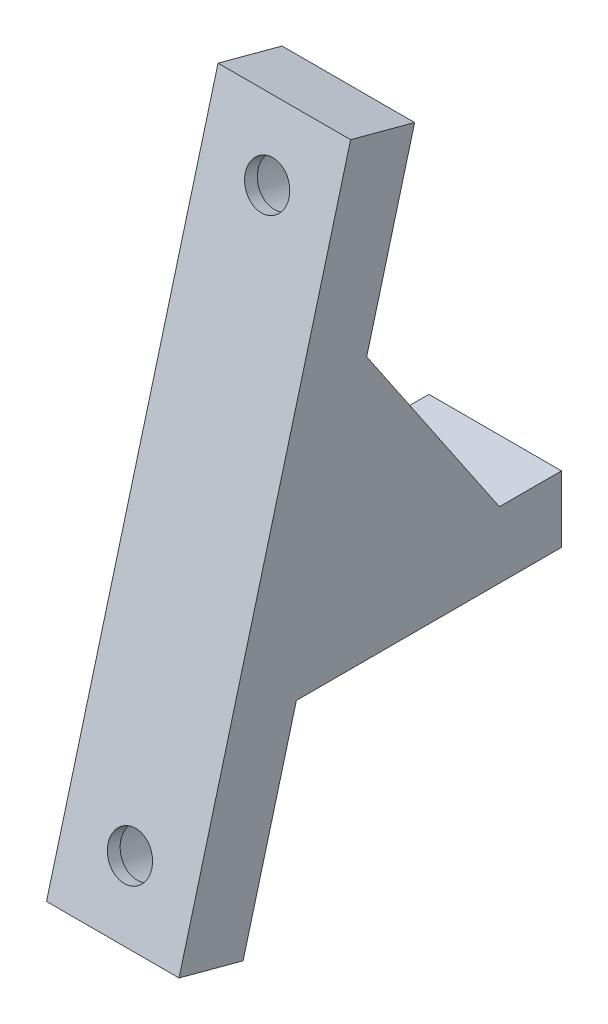
ISO-10303-21;
HEADER;
FILE_DESCRIPTION(('STEP AP214'),'2;1');
FILE_NAME('part.step','',(''),(''),'','','');
FILE_SCHEMA(('AUTOMOTIVE_DESIGN { 1 0 10303 214 1 1 1 1 }'));
ENDSEC;
DATA;
#1=APPLICATION_CONTEXT('core data for automotive mechanical design processes');
#2=APPLICATION_PROTOCOL_DEFINITION('international standard','automotive_design',2000,#1);
#3=PRODUCT_CONTEXT('',#1,'mechanical');
#4=PRODUCT('Part','Part','',(#3));
#5=PRODUCT_RELATED_PRODUCT_CATEGORY('part','',(#4));
#6=PRODUCT_DEFINITION_FORMATION('','',#4);
#7=PRODUCT_DEFINITION_CONTEXT('part definition',#1,'design');
#8=PRODUCT_DEFINITION('design','',#6,#7);
#9=PRODUCT_DEFINITION_SHAPE('','',#8);
#10=(LENGTH_UNIT() NAMED_UNIT(*) SI_UNIT(.MILLI.,.METRE.));
#11=(NAMED_UNIT(*) PLANE_ANGLE_UNIT() SI_UNIT($,.RADIAN.));
#12=(NAMED_UNIT(*) SI_UNIT($,.STERADIAN.) SOLID_ANGLE_UNIT());
#13=UNCERTAINTY_MEASURE_WITH_UNIT(LENGTH_MEASURE(1.E-05),#10,'distance_accuracy_value','');
#14=(GEOMETRIC_REPRESENTATION_CONTEXT(3) GLOBAL_UNCERTAINTY_ASSIGNED_CONTEXT((#13)) GLOBAL_UNIT_ASSIGNED_CONTEXT((#10,
#11,#12)) REPRESENTATION_CONTEXT('',''));
#15=CARTESIAN_POINT('',(0.,0.,0.));
#16=DIRECTION('',(0.,0.,1.));
#17=DIRECTION('',(1.,0.,0.));
#18=AXIS2_PLACEMENT_3D('',#15,#16,#17);
#19=CARTESIAN_POINT('',(5.,6.12372435695797,3.53553390593273));
#20=DIRECTION('',(0.,-0.258819045102525,-0.965925826289067));
#21=DIRECTION('',(0.,0.965925826289067,-0.258819045102525));
#22=AXIS2_PLACEMENT_3D('',#19,#20,#21);
#23=CYLINDRICAL_SURFACE('',#22,1.65);
#24=CARTESIAN_POINT('',(5.,4.82962913144534,-1.29409522551262));
#25=DIRECTION('',(0.,0.258819045102524,0.965925826289067));
#26=DIRECTION('',(0.,-0.965925826289068,0.258819045102524));
#27=AXIS2_PLACEMENT_3D('',#24,#25,#26);
#28=CIRCLE('',#27,1.65);
#29=CARTESIAN_POINT('',(5.,3.23585151806838,-0.867043801093457));
#30=VERTEX_POINT('',#29);
#31=EDGE_CURVE('E193',#30,#30,#28,.T.);
#32=ORIENTED_EDGE('',*,*,#31,.T.);
#33=EDGE_LOOP('',(#32));
#34=FACE_BOUND('',#33,.T.);
#35=CARTESIAN_POINT('',(5.,4.57081008634282,-2.26002105180168));
#36=DIRECTION('',(0.,-0.258819045102524,-0.965925826289067));
#37=DIRECTION('',(0.,0.965925826289067,-0.258819045102524));
#38=AXIS2_PLACEMENT_3D('',#35,#36,#37);
#39=CIRCLE('',#38,1.65);
#40=CARTESIAN_POINT('',(5.,6.16458769971978,-2.68707247622084));
#41=VERTEX_POINT('',#40);
#42=EDGE_CURVE('E49',#41,#41,#39,.F.);
#43=ORIENTED_EDGE('',*,*,#42,.F.);
#44=EDGE_LOOP('',(#43));
#45=FACE_BOUND('',#44,.T.);
#46=ADVANCED_FACE('F45',(#34,#45),#23,.F.);
#47=CARTESIAN_POINT('',(5.,44.7607574085207,-6.81722789816826));
#48=DIRECTION('',(0.,-0.258819045102525,-0.965925826289067));
#49=DIRECTION('',(0.,0.965925826289067,-0.258819045102525));
#50=AXIS2_PLACEMENT_3D('',#47,#48,#49);
#51=CYLINDRICAL_SURFACE('',#50,1.65);
#52=CARTESIAN_POINT('',(5.,43.466662183008,-11.6468570296136));
#53=DIRECTION('',(0.,0.258819045102524,0.965925826289067));
#54=DIRECTION('',(0.,-0.965925826289068,0.258819045102524));
#55=AXIS2_PLACEMENT_3D('',#52,#53,#54);
#56=CIRCLE('',#55,1.65);
#57=CARTESIAN_POINT('',(5.,41.8728845696311,-11.2198056051944));
#58=VERTEX_POINT('',#57);
#59=EDGE_CURVE('E158',#58,#58,#56,.T.);
#60=ORIENTED_EDGE('',*,*,#59,.T.);
#61=EDGE_LOOP('',(#60));
#62=FACE_BOUND('',#61,.T.);
#63=CARTESIAN_POINT('',(5.,43.2078431379055,-12.6127828559027));
#64=DIRECTION('',(0.,-0.258819045102524,-0.965925826289067));
#65=DIRECTION('',(0.,0.965925826289067,-0.258819045102524));
#66=AXIS2_PLACEMENT_3D('',#63,#64,#65);
#67=CIRCLE('',#66,1.65);
#68=CARTESIAN_POINT('',(5.,44.8016207512825,-13.0398342803218));
#69=VERTEX_POINT('',#68);
#70=EDGE_CURVE('E194',#69,#69,#67,.F.);
#71=ORIENTED_EDGE('',*,*,#70,.F.);
#72=EDGE_LOOP('',(#71));
#73=FACE_BOUND('',#72,.T.);
#74=ADVANCED_FACE('F277',(#62,#73),#51,.F.);
#75=CARTESIAN_POINT('',(10.,17.0806955361724,-25.2627557915542));
#76=DIRECTION('',(0.,0.560111023198253,-0.82841755274246));
#77=DIRECTION('',(0.,0.82841755274246,0.560111023198253));
#78=AXIS2_PLACEMENT_3D('',#75,#76,#77);
#79=PLANE('',#78);
#80=DIRECTION('',(-1.,0.,0.));
#81=VECTOR('',#80,1.);
#82=CARTESIAN_POINT('',(10.,18.7059047744874,-24.1639166779088));
#83=LINE('',#82,#81);
#84=CARTESIAN_POINT('',(10.,18.7059047744874,-24.1639166779088));
#85=VERTEX_POINT('',#84);
#86=CARTESIAN_POINT('',(7.98341142180157,18.7059047744874,-24.1639166779088));
#87=VERTEX_POINT('',#86);
#88=EDGE_CURVE('E64',#85,#87,#83,.T.);
#89=ORIENTED_EDGE('',*,*,#88,.T.);
#90=CARTESIAN_POINT('',(5.,19.1718707303731,-23.8488670179122));
#91=DIRECTION('',(0.,0.560111023198253,-0.82841755274246));
#92=DIRECTION('',(0.,-0.82841755274246,-0.560111023198253));
#93=AXIS2_PLACEMENT_3D('',#90,#91,#92);
#94=ELLIPSE('',#93,5.35608098349841,3.);
#95=CARTESIAN_POINT('',(2.01658857819843,18.7059047744874,-24.1639166779088));
#96=VERTEX_POINT('',#95);
#97=EDGE_CURVE('E216',#87,#96,#94,.F.);
#98=ORIENTED_EDGE('',*,*,#97,.T.);
#99=CARTESIAN_POINT('',(0.,18.7059047744874,-24.1639166779088));
#100=VERTEX_POINT('',#99);
#101=EDGE_CURVE('E103',#96,#100,#83,.T.);
#102=ORIENTED_EDGE('',*,*,#101,.T.);
#103=DIRECTION('',(0.,-0.82841755274246,-0.560111023198253));
#104=VECTOR('',#103,1.);
#105=CARTESIAN_POINT('',(0.,17.0806955361724,-25.2627557915542));
#106=LINE('',#105,#104);
#107=CARTESIAN_POINT('',(0.,33.5091413721001,-14.1551282717651));
#108=VERTEX_POINT('',#107);
#109=EDGE_CURVE('E155',#108,#100,#106,.T.);
#110=ORIENTED_EDGE('',*,*,#109,.F.);
#111=DIRECTION('',(-1.,0.,0.));
#112=VECTOR('',#111,1.);
#113=CARTESIAN_POINT('',(10.,33.5091413721001,-14.1551282717651));
#114=LINE('',#113,#112);
#115=CARTESIAN_POINT('',(10.,33.5091413721001,-14.1551282717651));
#116=VERTEX_POINT('',#115);
#117=EDGE_CURVE('E55',#116,#108,#114,.T.);
#118=ORIENTED_EDGE('',*,*,#117,.F.);
#119=DIRECTION('',(0.,-0.82841755274246,-0.560111023198253));
#120=VECTOR('',#119,1.);
#121=CARTESIAN_POINT('',(10.,17.0806955361724,-25.2627557915542));
#122=LINE('',#121,#120);
#123=EDGE_CURVE('E178',#116,#85,#122,.T.);
#124=ORIENTED_EDGE('',*,*,#123,.T.);
#125=EDGE_LOOP('',(#89,#98,#102,#110,#118,#124));
#126=FACE_BOUND('',#125,.T.);
#127=ADVANCED_FACE('F47',(#126),#79,.T.);
#128=CARTESIAN_POINT('',(5.,28.7059047744874,-23.8488670179122));
#129=DIRECTION('',(0.,-1.,0.));
#130=DIRECTION('',(0.,0.,-1.));
#131=AXIS2_PLACEMENT_3D('',#128,#129,#130);
#132=CYLINDRICAL_SURFACE('',#131,1.65);
#133=CARTESIAN_POINT('',(5.,13.7059047744874,-23.8488670179122));
#134=DIRECTION('',(0.,-1.,0.));
#135=DIRECTION('',(0.,0.,-1.));
#136=AXIS2_PLACEMENT_3D('',#133,#134,#135);
#137=CIRCLE('',#136,1.65);
#138=CARTESIAN_POINT('',(5.,13.7059047744874,-25.4988670179122));
#139=VERTEX_POINT('',#138);
#140=EDGE_CURVE('E218',#139,#139,#137,.F.);
#141=ORIENTED_EDGE('',*,*,#140,.F.);
#142=EDGE_LOOP('',(#141));
#143=FACE_BOUND('',#142,.T.);
#144=CARTESIAN_POINT('',(5.,18.7059047744874,-23.8488670179122));
#145=DIRECTION('',(0.,1.,0.));
#146=DIRECTION('',(0.,0.,1.));
#147=AXIS2_PLACEMENT_3D('',#144,#145,#146);
#148=CIRCLE('',#147,1.65);
#149=CARTESIAN_POINT('',(5.,18.7059047744874,-22.1988670179122));
#150=VERTEX_POINT('',#149);
#151=EDGE_CURVE('E11',#150,#150,#148,.F.);
#152=ORIENTED_EDGE('',*,*,#151,.F.);
#153=EDGE_LOOP('',(#152));
#154=FACE_BOUND('',#153,.T.);
#155=ADVANCED_FACE('F322',(#143,#154),#132,.F.);
#156=CARTESIAN_POINT('',(10.,-1.29409522551262,-4.82962913144532));
#157=DIRECTION('',(0.,-0.258819045102524,-0.965925826289067));
#158=DIRECTION('',(0.,0.965925826289067,-0.258819045102524));
#159=AXIS2_PLACEMENT_3D('',#156,#157,#158);
#160=PLANE('',#159);
#161=CARTESIAN_POINT('',(5.,42.1725669574954,-16.4764861610589));
#162=DIRECTION('',(0.,-0.258819045102524,-0.965925826289067));
#163=DIRECTION('',(0.,0.965925826289067,-0.258819045102524));
#164=AXIS2_PLACEMENT_3D('',#161,#162,#163);
#165=CIRCLE('',#164,2.25);
#166=CARTESIAN_POINT('',(5.,44.3459000666458,-17.0588290125396));
#167=VERTEX_POINT('',#166);
#168=EDGE_CURVE('E202',#167,#167,#165,.T.);
#169=ORIENTED_EDGE('',*,*,#168,.F.);
#170=EDGE_LOOP('',(#169));
#171=FACE_BOUND('',#170,.T.);
#172=DIRECTION('',(0.,-0.965925826289067,0.258819045102524));
#173=VECTOR('',#172,1.);
#174=CARTESIAN_POINT('',(0.,-1.29409522551262,-4.82962913144532));
#175=LINE('',#174,#173);
#176=CARTESIAN_POINT('',(0.,47.0021960889408,-17.7705813865715));
#177=VERTEX_POINT('',#176);
#178=EDGE_CURVE('E157',#177,#108,#175,.T.);
#179=ORIENTED_EDGE('',*,*,#178,.F.);
#180=DIRECTION('',(-1.,0.,0.));
#181=VECTOR('',#180,1.);
#182=CARTESIAN_POINT('',(10.,47.0021960889408,-17.7705813865715));
#183=LINE('',#182,#181);
#184=CARTESIAN_POINT('',(10.,47.0021960889408,-17.7705813865715));
#185=VERTEX_POINT('',#184);
#186=EDGE_CURVE('E189',#185,#177,#183,.T.);
#187=ORIENTED_EDGE('',*,*,#186,.F.);
#188=DIRECTION('',(0.,-0.965925826289067,0.258819045102524));
#189=VECTOR('',#188,1.);
#190=CARTESIAN_POINT('',(10.,-1.29409522551262,-4.82962913144532));
#191=LINE('',#190,#189);
#192=EDGE_CURVE('E224',#185,#116,#191,.T.);
#193=ORIENTED_EDGE('',*,*,#192,.T.);
#194=ORIENTED_EDGE('',*,*,#117,.T.);
#195=EDGE_LOOP('',(#179,#187,#193,#194));
#196=FACE_BOUND('',#195,.T.);
#197=ADVANCED_FACE('F256',(#171,#196),#160,.T.);
#198=CARTESIAN_POINT('',(10.,48.2962913144534,-12.9409522551261));
#199=DIRECTION('',(0.,0.965925826289068,-0.258819045102523));
#200=DIRECTION('',(0.,0.258819045102523,0.965925826289068));
#201=AXIS2_PLACEMENT_3D('',#198,#199,#200);
#202=PLANE('',#201);
#203=DIRECTION('',(0.,-0.258819045102523,-0.965925826289068));
#204=VECTOR('',#203,1.);
#205=CARTESIAN_POINT('',(0.,48.2962913144534,-12.9409522551261));
#206=LINE('',#205,#204);
#207=CARTESIAN_POINT('',(0.,48.2962913144534,-12.9409522551262));
#208=VERTEX_POINT('',#207);
#209=EDGE_CURVE('E161',#208,#177,#206,.T.);
#210=ORIENTED_EDGE('',*,*,#209,.F.);
#211=DIRECTION('',(-1.,0.,0.));
#212=VECTOR('',#211,1.);
#213=CARTESIAN_POINT('',(10.,48.2962913144534,-12.9409522551262));
#214=LINE('',#213,#212);
#215=CARTESIAN_POINT('',(10.,48.2962913144534,-12.9409522551262));
#216=VERTEX_POINT('',#215);
#217=EDGE_CURVE('E187',#216,#208,#214,.T.);
#218=ORIENTED_EDGE('',*,*,#217,.F.);
#219=DIRECTION('',(0.,-0.258819045102523,-0.965925826289068));
#220=VECTOR('',#219,1.);
#221=CARTESIAN_POINT('',(10.,48.2962913144534,-12.9409522551261));
#222=LINE('',#221,#220);
#223=EDGE_CURVE('E227',#216,#185,#222,.T.);
#224=ORIENTED_EDGE('',*,*,#223,.T.);
#225=ORIENTED_EDGE('',*,*,#186,.T.);
#226=EDGE_LOOP('',(#210,#218,#224,#225));
#227=FACE_BOUND('',#226,.T.);
#228=ADVANCED_FACE('F259',(#227),#202,.T.);
#229=CARTESIAN_POINT('',(10.,0.,0.));
#230=DIRECTION('',(0.,0.258819045102524,0.965925826289067));
#231=DIRECTION('',(0.,-0.965925826289068,0.258819045102524));
#232=AXIS2_PLACEMENT_3D('',#229,#230,#231);
#233=PLANE('',#232);
#234=ORIENTED_EDGE('',*,*,#59,.F.);
#235=EDGE_LOOP('',(#234));
#236=FACE_BOUND('',#235,.T.);
#237=ORIENTED_EDGE('',*,*,#31,.F.);
#238=EDGE_LOOP('',(#237));
#239=FACE_BOUND('',#238,.T.);
#240=DIRECTION('',(0.,0.965925826289067,-0.258819045102524));
#241=VECTOR('',#240,1.);
#242=CARTESIAN_POINT('',(0.,0.,0.));
#243=LINE('',#242,#241);
#244=CARTESIAN_POINT('',(0.,0.,0.));
#245=VERTEX_POINT('',#244);
#246=EDGE_CURVE('E164',#245,#208,#243,.T.);
#247=ORIENTED_EDGE('',*,*,#246,.F.);
#248=DIRECTION('',(-1.,0.,0.));
#249=VECTOR('',#248,1.);
#250=CARTESIAN_POINT('',(10.,0.,0.));
#251=LINE('',#250,#249);
#252=CARTESIAN_POINT('',(10.,0.,0.));
#253=VERTEX_POINT('',#252);
#254=EDGE_CURVE('E185',#253,#245,#251,.T.);
#255=ORIENTED_EDGE('',*,*,#254,.F.);
#256=DIRECTION('',(0.,0.965925826289067,-0.258819045102524));
#257=VECTOR('',#256,1.);
#258=CARTESIAN_POINT('',(10.,0.,0.));
#259=LINE('',#258,#257);
#260=EDGE_CURVE('E230',#253,#216,#259,.T.);
#261=ORIENTED_EDGE('',*,*,#260,.T.);
#262=ORIENTED_EDGE('',*,*,#217,.T.);
#263=EDGE_LOOP('',(#247,#255,#261,#262));
#264=FACE_BOUND('',#263,.T.);
#265=ADVANCED_FACE('F262',(#236,#239,#264),#233,.T.);
#266=CARTESIAN_POINT('',(10.,0.,0.));
#267=DIRECTION('',(0.,0.965925826289067,-0.258819045102524));
#268=DIRECTION('',(0.,0.258819045102524,0.965925826289067));
#269=AXIS2_PLACEMENT_3D('',#266,#267,#268);
#270=PLANE('',#269);
#271=DIRECTION('',(0.,-0.258819045102524,-0.965925826289067));
#272=VECTOR('',#271,1.);
#273=CARTESIAN_POINT('',(0.,0.,0.));
#274=LINE('',#273,#272);
#275=CARTESIAN_POINT('',(0.,-1.29409522551262,-4.82962913144533));
#276=VERTEX_POINT('',#275);
#277=EDGE_CURVE('E167',#245,#276,#274,.T.);
#278=ORIENTED_EDGE('',*,*,#277,.T.);
#279=DIRECTION('',(-1.,0.,0.));
#280=VECTOR('',#279,1.);
#281=CARTESIAN_POINT('',(10.,-1.29409522551262,-4.82962913144533));
#282=LINE('',#281,#280);
#283=CARTESIAN_POINT('',(10.,-1.29409522551262,-4.82962913144533));
#284=VERTEX_POINT('',#283);
#285=EDGE_CURVE('E182',#284,#276,#282,.T.);
#286=ORIENTED_EDGE('',*,*,#285,.F.);
#287=DIRECTION('',(0.,-0.258819045102524,-0.965925826289067));
#288=VECTOR('',#287,1.);
#289=CARTESIAN_POINT('',(10.,0.,0.));
#290=LINE('',#289,#288);
#291=EDGE_CURVE('E233',#253,#284,#290,.T.);
#292=ORIENTED_EDGE('',*,*,#291,.F.);
#293=ORIENTED_EDGE('',*,*,#254,.T.);
#294=EDGE_LOOP('',(#278,#286,#292,#293));
#295=FACE_BOUND('',#294,.T.);
#296=ADVANCED_FACE('F239',(#295),#270,.F.);
#297=CARTESIAN_POINT('',(10.,-1.29409522551262,-4.82962913144533));
#298=DIRECTION('',(0.,0.258819045102524,0.965925826289067));
#299=DIRECTION('',(0.,-0.965925826289067,0.258819045102524));
#300=AXIS2_PLACEMENT_3D('',#297,#298,#299);
#301=PLANE('',#300);
#302=CARTESIAN_POINT('',(5.,3.53553390593272,-6.12372435695795));
#303=DIRECTION('',(0.,-0.258819045102524,-0.965925826289067));
#304=DIRECTION('',(0.,0.965925826289067,-0.258819045102524));
#305=AXIS2_PLACEMENT_3D('',#302,#303,#304);
#306=CIRCLE('',#305,2.25);
#307=CARTESIAN_POINT('',(5.,5.70886701508312,-6.70606720843863));
#308=VERTEX_POINT('',#307);
#309=EDGE_CURVE('E207',#308,#308,#306,.T.);
#310=ORIENTED_EDGE('',*,*,#309,.F.);
#311=EDGE_LOOP('',(#310));
#312=FACE_BOUND('',#311,.T.);
#313=DIRECTION('',(0.,0.965925826289067,-0.258819045102524));
#314=VECTOR('',#313,1.);
#315=CARTESIAN_POINT('',(0.,-1.29409522551262,-4.82962913144533));
#316=LINE('',#315,#314);
#317=CARTESIAN_POINT('',(0.,13.7059047744874,-8.84886701791223));
#318=VERTEX_POINT('',#317);
#319=EDGE_CURVE('E169',#276,#318,#316,.T.);
#320=ORIENTED_EDGE('',*,*,#319,.T.);
#321=DIRECTION('',(-1.,0.,0.));
#322=VECTOR('',#321,1.);
#323=CARTESIAN_POINT('',(10.,13.7059047744874,-8.84886701791223));
#324=LINE('',#323,#322);
#325=CARTESIAN_POINT('',(10.,13.7059047744874,-8.84886701791223));
#326=VERTEX_POINT('',#325);
#327=EDGE_CURVE('E138',#326,#318,#324,.T.);
#328=ORIENTED_EDGE('',*,*,#327,.F.);
#329=DIRECTION('',(0.,0.965925826289067,-0.258819045102524));
#330=VECTOR('',#329,1.);
#331=CARTESIAN_POINT('',(10.,-1.29409522551262,-4.82962913144533));
#332=LINE('',#331,#330);
#333=EDGE_CURVE('E146',#284,#326,#332,.T.);
#334=ORIENTED_EDGE('',*,*,#333,.F.);
#335=ORIENTED_EDGE('',*,*,#285,.T.);
#336=EDGE_LOOP('',(#320,#328,#334,#335));
#337=FACE_BOUND('',#336,.T.);
#338=ADVANCED_FACE('F243',(#312,#337),#301,.F.);
#339=CARTESIAN_POINT('',(10.,13.7059047744874,0.));
#340=DIRECTION('',(0.,-1.,0.));
#341=DIRECTION('',(0.,0.,-1.));
#342=AXIS2_PLACEMENT_3D('',#339,#340,#341);
#343=PLANE('',#342);
#344=ORIENTED_EDGE('',*,*,#140,.T.);
#345=EDGE_LOOP('',(#344));
#346=FACE_BOUND('',#345,.T.);
#347=DIRECTION('',(0.,0.,1.));
#348=VECTOR('',#347,1.);
#349=CARTESIAN_POINT('',(0.,13.7059047744874,0.));
#350=LINE('',#349,#348);
#351=CARTESIAN_POINT('',(0.,13.7059047744874,-28.8488670179122));
#352=VERTEX_POINT('',#351);
#353=EDGE_CURVE('E134',#352,#318,#350,.T.);
#354=ORIENTED_EDGE('',*,*,#353,.F.);
#355=DIRECTION('',(-1.,0.,0.));
#356=VECTOR('',#355,1.);
#357=CARTESIAN_POINT('',(10.,13.7059047744874,-28.8488670179122));
#358=LINE('',#357,#356);
#359=CARTESIAN_POINT('',(10.,13.7059047744874,-28.8488670179122));
#360=VERTEX_POINT('',#359);
#361=EDGE_CURVE('E129',#360,#352,#358,.T.);
#362=ORIENTED_EDGE('',*,*,#361,.F.);
#363=DIRECTION('',(0.,0.,1.));
#364=VECTOR('',#363,1.);
#365=CARTESIAN_POINT('',(10.,13.7059047744874,0.));
#366=LINE('',#365,#364);
#367=EDGE_CURVE('E132',#360,#326,#366,.T.);
#368=ORIENTED_EDGE('',*,*,#367,.T.);
#369=ORIENTED_EDGE('',*,*,#327,.T.);
#370=EDGE_LOOP('',(#354,#362,#368,#369));
#371=FACE_BOUND('',#370,.T.);
#372=ADVANCED_FACE('F131',(#346,#371),#343,.T.);
#373=CARTESIAN_POINT('',(10.,0.,-28.8488670179122));
#374=DIRECTION('',(0.,0.,-1.));
#375=DIRECTION('',(0.,1.,0.));
#376=AXIS2_PLACEMENT_3D('',#373,#374,#375);
#377=PLANE('',#376);
#378=DIRECTION('',(0.,-1.,0.));
#379=VECTOR('',#378,1.);
#380=CARTESIAN_POINT('',(0.,0.,-28.8488670179122));
#381=LINE('',#380,#379);
#382=CARTESIAN_POINT('',(0.,18.7059047744874,-28.8488670179122));
#383=VERTEX_POINT('',#382);
#384=EDGE_CURVE('E173',#383,#352,#381,.T.);
#385=ORIENTED_EDGE('',*,*,#384,.F.);
#386=DIRECTION('',(-1.,0.,0.));
#387=VECTOR('',#386,1.);
#388=CARTESIAN_POINT('',(10.,18.7059047744874,-28.8488670179122));
#389=LINE('',#388,#387);
#390=CARTESIAN_POINT('',(10.,18.7059047744874,-28.8488670179122));
#391=VERTEX_POINT('',#390);
#392=EDGE_CURVE('E95',#391,#383,#389,.T.);
#393=ORIENTED_EDGE('',*,*,#392,.F.);
#394=DIRECTION('',(0.,-1.,0.));
#395=VECTOR('',#394,1.);
#396=CARTESIAN_POINT('',(10.,0.,-28.8488670179122));
#397=LINE('',#396,#395);
#398=EDGE_CURVE('E144',#391,#360,#397,.T.);
#399=ORIENTED_EDGE('',*,*,#398,.T.);
#400=ORIENTED_EDGE('',*,*,#361,.T.);
#401=EDGE_LOOP('',(#385,#393,#399,#400));
#402=FACE_BOUND('',#401,.T.);
#403=ADVANCED_FACE('F149',(#402),#377,.T.);
#404=CARTESIAN_POINT('',(10.,18.7059047744874,0.));
#405=DIRECTION('',(0.,1.,0.));
#406=DIRECTION('',(0.,0.,1.));
#407=AXIS2_PLACEMENT_3D('',#404,#405,#406);
#408=PLANE('',#407);
#409=ORIENTED_EDGE('',*,*,#101,.F.);
#410=CARTESIAN_POINT('',(5.,18.7059047744874,-23.8488670179122));
#411=DIRECTION('',(0.,1.,0.));
#412=DIRECTION('',(0.,0.,1.));
#413=AXIS2_PLACEMENT_3D('',#410,#411,#412);
#414=CIRCLE('',#413,3.);
#415=EDGE_CURVE('E200',#96,#87,#414,.T.);
#416=ORIENTED_EDGE('',*,*,#415,.T.);
#417=ORIENTED_EDGE('',*,*,#88,.F.);
#418=DIRECTION('',(0.,0.,-1.));
#419=VECTOR('',#418,1.);
#420=CARTESIAN_POINT('',(10.,18.7059047744874,0.));
#421=LINE('',#420,#419);
#422=EDGE_CURVE('E150',#85,#391,#421,.T.);
#423=ORIENTED_EDGE('',*,*,#422,.T.);
#424=ORIENTED_EDGE('',*,*,#392,.T.);
#425=DIRECTION('',(0.,0.,-1.));
#426=VECTOR('',#425,1.);
#427=CARTESIAN_POINT('',(0.,18.7059047744874,0.));
#428=LINE('',#427,#426);
#429=EDGE_CURVE('E175',#100,#383,#428,.T.);
#430=ORIENTED_EDGE('',*,*,#429,.F.);
#431=EDGE_LOOP('',(#409,#416,#417,#423,#424,#430));
#432=FACE_BOUND('',#431,.T.);
#433=ORIENTED_EDGE('',*,*,#151,.T.);
#434=EDGE_LOOP('',(#433));
#435=FACE_BOUND('',#434,.T.);
#436=ADVANCED_FACE('F246',(#432,#435),#408,.T.);
#437=CARTESIAN_POINT('',(10.,0.,0.));
#438=DIRECTION('',(1.,0.,0.));
#439=DIRECTION('',(0.,0.,-1.));
#440=AXIS2_PLACEMENT_3D('',#437,#438,#439);
#441=PLANE('',#440);
#442=ORIENTED_EDGE('',*,*,#123,.F.);
#443=ORIENTED_EDGE('',*,*,#192,.F.);
#444=ORIENTED_EDGE('',*,*,#223,.F.);
#445=ORIENTED_EDGE('',*,*,#260,.F.);
#446=ORIENTED_EDGE('',*,*,#291,.T.);
#447=ORIENTED_EDGE('',*,*,#333,.T.);
#448=ORIENTED_EDGE('',*,*,#367,.F.);
#449=ORIENTED_EDGE('',*,*,#398,.F.);
#450=ORIENTED_EDGE('',*,*,#422,.F.);
#451=EDGE_LOOP('',(#442,#443,#444,#445,#446,#447,#448,#449,#450));
#452=FACE_BOUND('',#451,.T.);
#453=ADVANCED_FACE('F142',(#452),#441,.T.);
#454=CARTESIAN_POINT('',(0.,0.,0.));
#455=DIRECTION('',(1.,0.,0.));
#456=DIRECTION('',(0.,0.,-1.));
#457=AXIS2_PLACEMENT_3D('',#454,#455,#456);
#458=PLANE('',#457);
#459=ORIENTED_EDGE('',*,*,#109,.T.);
#460=ORIENTED_EDGE('',*,*,#429,.T.);
#461=ORIENTED_EDGE('',*,*,#384,.T.);
#462=ORIENTED_EDGE('',*,*,#353,.T.);
#463=ORIENTED_EDGE('',*,*,#319,.F.);
#464=ORIENTED_EDGE('',*,*,#277,.F.);
#465=ORIENTED_EDGE('',*,*,#246,.T.);
#466=ORIENTED_EDGE('',*,*,#209,.T.);
#467=ORIENTED_EDGE('',*,*,#178,.T.);
#468=EDGE_LOOP('',(#459,#460,#461,#462,#463,#464,#465,#466,#467));
#469=FACE_BOUND('',#468,.T.);
#470=ADVANCED_FACE('F245',(#469),#458,.F.);
#471=CARTESIAN_POINT('',(5.,26.7059047744874,-23.8488670179122));
#472=DIRECTION('',(0.,-1.,0.));
#473=DIRECTION('',(0.,0.,-1.));
#474=AXIS2_PLACEMENT_3D('',#471,#472,#473);
#475=CYLINDRICAL_SURFACE('',#474,3.);
#476=ORIENTED_EDGE('',*,*,#415,.F.);
#477=ORIENTED_EDGE('',*,*,#97,.F.);
#478=EDGE_LOOP('',(#476,#477));
#479=FACE_BOUND('',#478,.T.);
#480=ADVANCED_FACE('F252',(#479),#475,.F.);
#481=CARTESIAN_POINT('',(5.,43.2078431379055,-12.6127828559027));
#482=DIRECTION('',(0.,-0.258819045102524,-0.965925826289067));
#483=DIRECTION('',(0.,0.965925826289067,-0.258819045102524));
#484=AXIS2_PLACEMENT_3D('',#481,#482,#483);
#485=PLANE('',#484);
#486=CARTESIAN_POINT('',(5.,43.2078431379055,-12.6127828559027));
#487=DIRECTION('',(0.,-0.258819045102524,-0.965925826289067));
#488=DIRECTION('',(0.,0.965925826289067,-0.258819045102524));
#489=AXIS2_PLACEMENT_3D('',#486,#487,#488);
#490=CIRCLE('',#489,2.25);
#491=CARTESIAN_POINT('',(5.,45.3811762470559,-13.1951257073833));
#492=VERTEX_POINT('',#491);
#493=EDGE_CURVE('E196',#492,#492,#490,.T.);
#494=ORIENTED_EDGE('',*,*,#493,.T.);
#495=EDGE_LOOP('',(#494));
#496=FACE_BOUND('',#495,.T.);
#497=ORIENTED_EDGE('',*,*,#70,.T.);
#498=EDGE_LOOP('',(#497));
#499=FACE_BOUND('',#498,.T.);
#500=ADVANCED_FACE('F321',(#496,#499),#485,.T.);
#501=CARTESIAN_POINT('',(5.,43.2078431379055,-12.6127828559027));
#502=DIRECTION('',(0.,-0.258819045102524,-0.965925826289067));
#503=DIRECTION('',(0.,0.965925826289067,-0.258819045102524));
#504=AXIS2_PLACEMENT_3D('',#501,#502,#503);
#505=CYLINDRICAL_SURFACE('',#504,2.25);
#506=ORIENTED_EDGE('',*,*,#493,.F.);
#507=EDGE_LOOP('',(#506));
#508=FACE_BOUND('',#507,.T.);
#509=ORIENTED_EDGE('',*,*,#168,.T.);
#510=EDGE_LOOP('',(#509));
#511=FACE_BOUND('',#510,.T.);
#512=ADVANCED_FACE('F314',(#508,#511),#505,.F.);
#513=CARTESIAN_POINT('',(5.,4.57081008634282,-2.26002105180168));
#514=DIRECTION('',(0.,-0.258819045102524,-0.965925826289067));
#515=DIRECTION('',(0.,0.965925826289067,-0.258819045102524));
#516=AXIS2_PLACEMENT_3D('',#513,#514,#515);
#517=PLANE('',#516);
#518=CARTESIAN_POINT('',(5.,4.57081008634282,-2.26002105180168));
#519=DIRECTION('',(0.,-0.258819045102524,-0.965925826289067));
#520=DIRECTION('',(0.,0.965925826289067,-0.258819045102524));
#521=AXIS2_PLACEMENT_3D('',#518,#519,#520);
#522=CIRCLE('',#521,2.25);
#523=CARTESIAN_POINT('',(5.,6.74414319549322,-2.84236390328236));
#524=VERTEX_POINT('',#523);
#525=EDGE_CURVE('E212',#524,#524,#522,.T.);
#526=ORIENTED_EDGE('',*,*,#525,.T.);
#527=EDGE_LOOP('',(#526));
#528=FACE_BOUND('',#527,.T.);
#529=ORIENTED_EDGE('',*,*,#42,.T.);
#530=EDGE_LOOP('',(#529));
#531=FACE_BOUND('',#530,.T.);
#532=ADVANCED_FACE('F308',(#528,#531),#517,.T.);
#533=CARTESIAN_POINT('',(5.,4.57081008634282,-2.26002105180168));
#534=DIRECTION('',(0.,-0.258819045102524,-0.965925826289067));
#535=DIRECTION('',(0.,0.965925826289067,-0.258819045102524));
#536=AXIS2_PLACEMENT_3D('',#533,#534,#535);
#537=CYLINDRICAL_SURFACE('',#536,2.25);
#538=ORIENTED_EDGE('',*,*,#525,.F.);
#539=EDGE_LOOP('',(#538));
#540=FACE_BOUND('',#539,.T.);
#541=ORIENTED_EDGE('',*,*,#309,.T.);
#542=EDGE_LOOP('',(#541));
#543=FACE_BOUND('',#542,.T.);
#544=ADVANCED_FACE('F306',(#540,#543),#537,.F.);
#545=CLOSED_SHELL('',(#46,#74,#127,#155,#197,#228,#265,#296,#338,#372,#403,#436,#453,#470,#480,
#500,#512,#532,#544));
#546=MANIFOLD_SOLID_BREP('B2',#545);
#547=ADVANCED_BREP_SHAPE_REPRESENTATION('',(#18,#546),#14);
#548=SHAPE_DEFINITION_REPRESENTATION(#9,#547);
ENDSEC;
END-ISO-10303-21;
